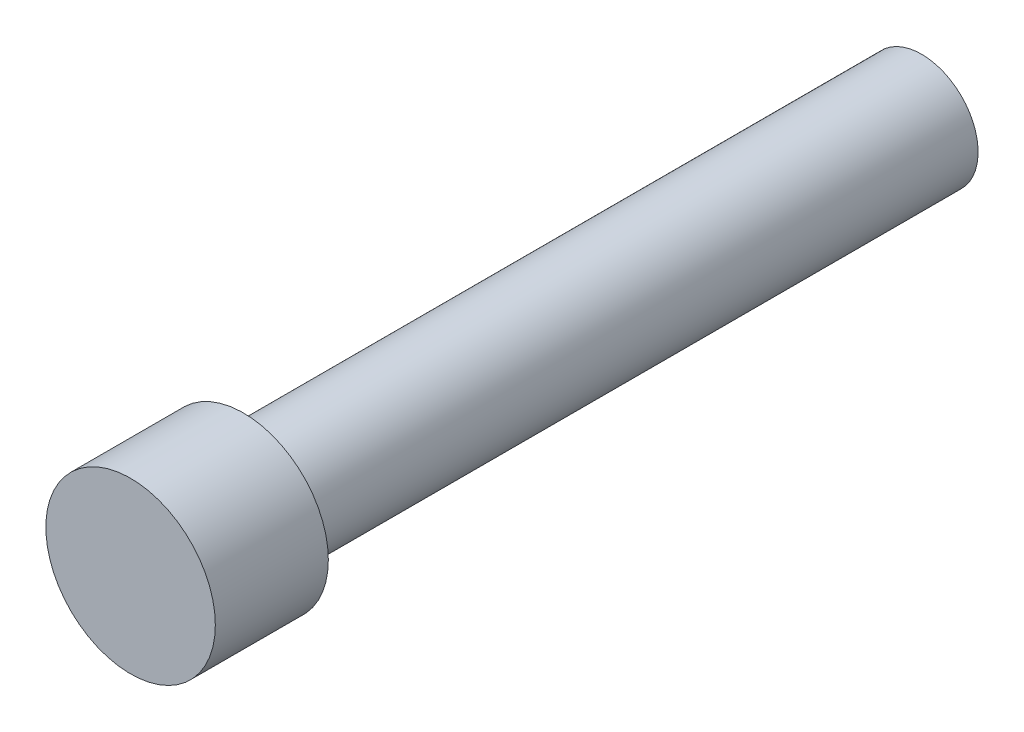
ISO-10303-21;
HEADER;
FILE_DESCRIPTION(('STEP AP214'),'2;1');
FILE_NAME('part.step','',(''),(''),'','','');
FILE_SCHEMA(('AUTOMOTIVE_DESIGN { 1 0 10303 214 1 1 1 1 }'));
ENDSEC;
DATA;
#1=APPLICATION_CONTEXT('core data for automotive mechanical design processes');
#2=APPLICATION_PROTOCOL_DEFINITION('international standard','automotive_design',2000,#1);
#3=PRODUCT_CONTEXT('',#1,'mechanical');
#4=PRODUCT('Part','Part','',(#3));
#5=PRODUCT_RELATED_PRODUCT_CATEGORY('part','',(#4));
#6=PRODUCT_DEFINITION_FORMATION('','',#4);
#7=PRODUCT_DEFINITION_CONTEXT('part definition',#1,'design');
#8=PRODUCT_DEFINITION('design','',#6,#7);
#9=PRODUCT_DEFINITION_SHAPE('','',#8);
#10=(LENGTH_UNIT() NAMED_UNIT(*) SI_UNIT(.MILLI.,.METRE.));
#11=(NAMED_UNIT(*) PLANE_ANGLE_UNIT() SI_UNIT($,.RADIAN.));
#12=(NAMED_UNIT(*) SI_UNIT($,.STERADIAN.) SOLID_ANGLE_UNIT());
#13=UNCERTAINTY_MEASURE_WITH_UNIT(LENGTH_MEASURE(1.E-05),#10,'distance_accuracy_value','');
#14=(GEOMETRIC_REPRESENTATION_CONTEXT(3) GLOBAL_UNCERTAINTY_ASSIGNED_CONTEXT((#13)) GLOBAL_UNIT_ASSIGNED_CONTEXT((#10,
#11,#12)) REPRESENTATION_CONTEXT('',''));
#15=CARTESIAN_POINT('',(0.,0.,0.));
#16=DIRECTION('',(0.,0.,1.));
#17=DIRECTION('',(1.,0.,0.));
#18=AXIS2_PLACEMENT_3D('',#15,#16,#17);
#19=CARTESIAN_POINT('',(0.,0.,2.));
#20=DIRECTION('',(0.,0.,-1.));
#21=DIRECTION('',(-1.,0.,0.));
#22=AXIS2_PLACEMENT_3D('',#19,#20,#21);
#23=CYLINDRICAL_SURFACE('',#22,1.5);
#24=CARTESIAN_POINT('',(0.,0.,2.));
#25=DIRECTION('',(0.,0.,1.));
#26=DIRECTION('',(1.,0.,0.));
#27=AXIS2_PLACEMENT_3D('',#24,#25,#26);
#28=CIRCLE('',#27,1.5);
#29=CARTESIAN_POINT('',(1.5,0.,2.));
#30=VERTEX_POINT('',#29);
#31=EDGE_CURVE('E45',#30,#30,#28,.T.);
#32=ORIENTED_EDGE('',*,*,#31,.F.);
#33=EDGE_LOOP('',(#32));
#34=FACE_BOUND('',#33,.T.);
#35=CARTESIAN_POINT('',(0.,0.,0.));
#36=DIRECTION('',(0.,0.,1.));
#37=DIRECTION('',(1.,0.,0.));
#38=AXIS2_PLACEMENT_3D('',#35,#36,#37);
#39=CIRCLE('',#38,1.5);
#40=CARTESIAN_POINT('',(1.5,0.,0.));
#41=VERTEX_POINT('',#40);
#42=EDGE_CURVE('E40',#41,#41,#39,.T.);
#43=ORIENTED_EDGE('',*,*,#42,.T.);
#44=EDGE_LOOP('',(#43));
#45=FACE_BOUND('',#44,.T.);
#46=ADVANCED_FACE('F37',(#34,#45),#23,.T.);
#47=CARTESIAN_POINT('',(0.,0.,2.));
#48=DIRECTION('',(0.,0.,1.));
#49=DIRECTION('',(1.,0.,0.));
#50=AXIS2_PLACEMENT_3D('',#47,#48,#49);
#51=PLANE('',#50);
#52=ORIENTED_EDGE('',*,*,#31,.T.);
#53=EDGE_LOOP('',(#52));
#54=FACE_BOUND('',#53,.T.);
#55=ADVANCED_FACE('F65',(#54),#51,.T.);
#56=CARTESIAN_POINT('',(0.,0.,0.));
#57=DIRECTION('',(0.,0.,1.));
#58=DIRECTION('',(1.,0.,0.));
#59=AXIS2_PLACEMENT_3D('',#56,#57,#58);
#60=PLANE('',#59);
#61=CARTESIAN_POINT('',(0.,0.,0.));
#62=DIRECTION('',(0.,0.,-1.));
#63=DIRECTION('',(-1.,0.,0.));
#64=AXIS2_PLACEMENT_3D('',#61,#62,#63);
#65=CIRCLE('',#64,1.);
#66=CARTESIAN_POINT('',(-1.,0.,0.));
#67=VERTEX_POINT('',#66);
#68=EDGE_CURVE('E10',#67,#67,#65,.T.);
#69=ORIENTED_EDGE('',*,*,#68,.F.);
#70=EDGE_LOOP('',(#69));
#71=FACE_BOUND('',#70,.T.);
#72=ORIENTED_EDGE('',*,*,#42,.F.);
#73=EDGE_LOOP('',(#72));
#74=FACE_BOUND('',#73,.T.);
#75=ADVANCED_FACE('F62',(#71,#74),#60,.F.);
#76=CARTESIAN_POINT('',(0.,0.,-12.));
#77=DIRECTION('',(0.,0.,1.));
#78=DIRECTION('',(1.,0.,0.));
#79=AXIS2_PLACEMENT_3D('',#76,#77,#78);
#80=CYLINDRICAL_SURFACE('',#79,1.);
#81=CARTESIAN_POINT('',(0.,0.,-12.));
#82=DIRECTION('',(0.,0.,-1.));
#83=DIRECTION('',(-1.,0.,0.));
#84=AXIS2_PLACEMENT_3D('',#81,#82,#83);
#85=CIRCLE('',#84,1.);
#86=CARTESIAN_POINT('',(-1.,0.,-12.));
#87=VERTEX_POINT('',#86);
#88=EDGE_CURVE('E52',#87,#87,#85,.T.);
#89=ORIENTED_EDGE('',*,*,#88,.F.);
#90=EDGE_LOOP('',(#89));
#91=FACE_BOUND('',#90,.T.);
#92=ORIENTED_EDGE('',*,*,#68,.T.);
#93=EDGE_LOOP('',(#92));
#94=FACE_BOUND('',#93,.T.);
#95=ADVANCED_FACE('F64',(#91,#94),#80,.T.);
#96=CARTESIAN_POINT('',(0.,0.,-12.));
#97=DIRECTION('',(0.,0.,-1.));
#98=DIRECTION('',(-1.,0.,0.));
#99=AXIS2_PLACEMENT_3D('',#96,#97,#98);
#100=PLANE('',#99);
#101=ORIENTED_EDGE('',*,*,#88,.T.);
#102=EDGE_LOOP('',(#101));
#103=FACE_BOUND('',#102,.T.);
#104=ADVANCED_FACE('F71',(#103),#100,.T.);
#105=CLOSED_SHELL('',(#46,#55,#75,#95,#104));
#106=MANIFOLD_SOLID_BREP('B2',#105);
#107=ADVANCED_BREP_SHAPE_REPRESENTATION('',(#18,#106),#14);
#108=SHAPE_DEFINITION_REPRESENTATION(#9,#107);
ENDSEC;
END-ISO-10303-21;
